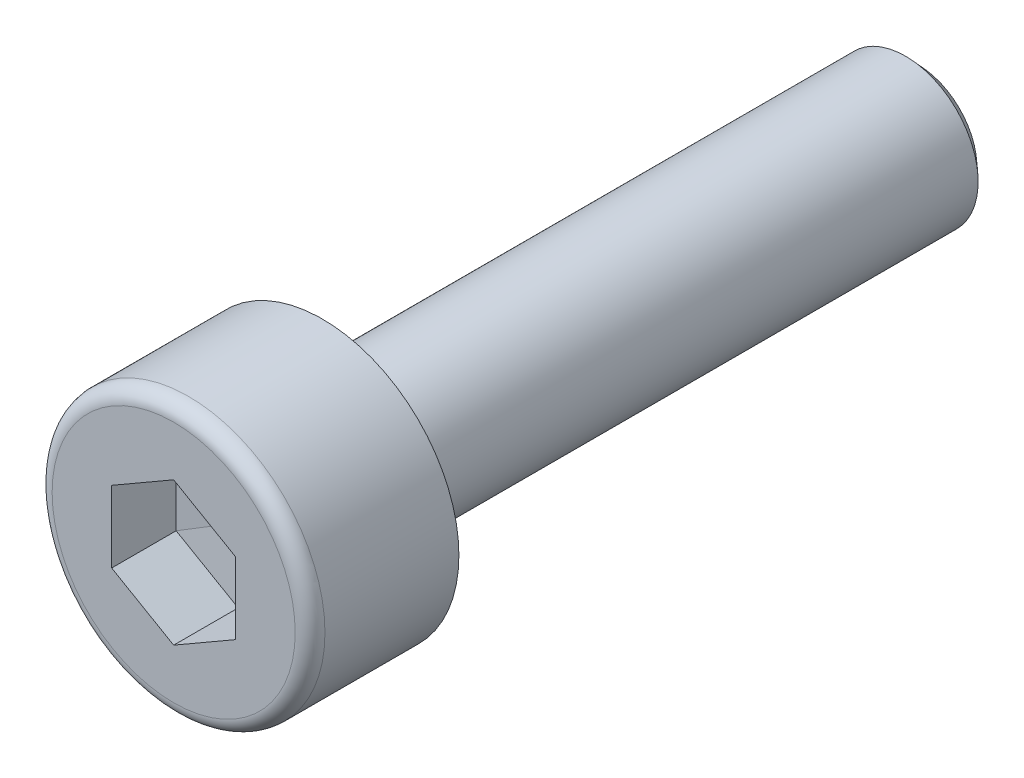
ISO-10303-21;
HEADER;
FILE_DESCRIPTION(('STEP AP214'),'2;1');
FILE_NAME('part.step','',(''),(''),'','','');
FILE_SCHEMA(('AUTOMOTIVE_DESIGN { 1 0 10303 214 1 1 1 1 }'));
ENDSEC;
DATA;
#1=APPLICATION_CONTEXT('core data for automotive mechanical design processes');
#2=APPLICATION_PROTOCOL_DEFINITION('international standard','automotive_design',2000,#1);
#3=PRODUCT_CONTEXT('',#1,'mechanical');
#4=PRODUCT('Part','Part','',(#3));
#5=PRODUCT_RELATED_PRODUCT_CATEGORY('part','',(#4));
#6=PRODUCT_DEFINITION_FORMATION('','',#4);
#7=PRODUCT_DEFINITION_CONTEXT('part definition',#1,'design');
#8=PRODUCT_DEFINITION('design','',#6,#7);
#9=PRODUCT_DEFINITION_SHAPE('','',#8);
#10=(LENGTH_UNIT() NAMED_UNIT(*) SI_UNIT(.MILLI.,.METRE.));
#11=(NAMED_UNIT(*) PLANE_ANGLE_UNIT() SI_UNIT($,.RADIAN.));
#12=(NAMED_UNIT(*) SI_UNIT($,.STERADIAN.) SOLID_ANGLE_UNIT());
#13=UNCERTAINTY_MEASURE_WITH_UNIT(LENGTH_MEASURE(1.E-05),#10,'distance_accuracy_value','');
#14=(GEOMETRIC_REPRESENTATION_CONTEXT(3) GLOBAL_UNCERTAINTY_ASSIGNED_CONTEXT((#13)) GLOBAL_UNIT_ASSIGNED_CONTEXT((#10,
#11,#12)) REPRESENTATION_CONTEXT('',''));
#15=CARTESIAN_POINT('',(0.,0.,0.));
#16=DIRECTION('',(0.,0.,1.));
#17=DIRECTION('',(1.,0.,0.));
#18=AXIS2_PLACEMENT_3D('',#15,#16,#17);
#19=CARTESIAN_POINT('',(-1.50000000000011,0.,-1.93470335983093E-13));
#20=DIRECTION('',(0.,0.,-1.));
#21=DIRECTION('',(0.,-1.,0.));
#22=AXIS2_PLACEMENT_3D('',#19,#20,#21);
#23=PLANE('',#22);
#24=CARTESIAN_POINT('',(-1.10557921610427E-13,0.,-1.77635683940025E-13));
#25=DIRECTION('',(0.,0.,-1.));
#26=DIRECTION('',(-1.,0.,0.));
#27=AXIS2_PLACEMENT_3D('',#24,#25,#26);
#28=CIRCLE('',#27,1.4635);
#29=CARTESIAN_POINT('',(-1.46350000000011,0.,-1.92747036469691E-13));
#30=VERTEX_POINT('',#29);
#31=EDGE_CURVE('E11',#30,#30,#28,.T.);
#32=ORIENTED_EDGE('',*,*,#31,.F.);
#33=EDGE_LOOP('',(#32));
#34=FACE_BOUND('',#33,.T.);
#35=CARTESIAN_POINT('',(-1.10557921610426E-13,0.,-3.3104020176651E-13));
#36=DIRECTION('',(0.,0.,-1.));
#37=DIRECTION('',(1.,0.,0.));
#38=AXIS2_PLACEMENT_3D('',#35,#36,#37);
#39=CIRCLE('',#38,2.75);
#40=CARTESIAN_POINT('',(2.74999999999989,0.,-3.0277835099299E-13));
#41=VERTEX_POINT('',#40);
#42=EDGE_CURVE('E115',#41,#41,#39,.T.);
#43=ORIENTED_EDGE('',*,*,#42,.T.);
#44=EDGE_LOOP('',(#43));
#45=FACE_BOUND('',#44,.T.);
#46=ADVANCED_FACE('F17',(#34,#45),#23,.T.);
#47=CARTESIAN_POINT('',(0.,0.,-12.));
#48=DIRECTION('',(0.,0.,-1.));
#49=DIRECTION('',(0.,-1.,0.));
#50=AXIS2_PLACEMENT_3D('',#47,#48,#49);
#51=PLANE('',#50);
#52=CARTESIAN_POINT('',(0.,0.,-12.));
#53=DIRECTION('',(0.,0.,-1.));
#54=DIRECTION('',(-1.,0.,0.));
#55=AXIS2_PLACEMENT_3D('',#52,#53,#54);
#56=CIRCLE('',#55,1.193275);
#57=CARTESIAN_POINT('',(-1.193275,0.,-12.));
#58=VERTEX_POINT('',#57);
#59=EDGE_CURVE('E252',#58,#58,#56,.T.);
#60=ORIENTED_EDGE('',*,*,#59,.T.);
#61=EDGE_LOOP('',(#60));
#62=FACE_BOUND('',#61,.T.);
#63=ADVANCED_FACE('F313',(#62),#51,.T.);
#64=CARTESIAN_POINT('',(0.,0.,-6.00000000000008));
#65=DIRECTION('',(0.,0.,-1.));
#66=DIRECTION('',(-1.,0.,0.));
#67=AXIS2_PLACEMENT_3D('',#64,#65,#66);
#68=CYLINDRICAL_SURFACE('',#67,1.4635);
#69=ORIENTED_EDGE('',*,*,#31,.T.);
#70=EDGE_LOOP('',(#69));
#71=FACE_BOUND('',#70,.T.);
#72=CARTESIAN_POINT('',(0.,0.,-11.7538502839854));
#73=DIRECTION('',(0.,0.,1.));
#74=DIRECTION('',(-1.,0.,0.));
#75=AXIS2_PLACEMENT_3D('',#72,#73,#74);
#76=CIRCLE('',#75,1.4635);
#77=CARTESIAN_POINT('',(-1.46349999999999,0.,-11.7538502839854));
#78=VERTEX_POINT('',#77);
#79=EDGE_CURVE('E291',#78,#78,#76,.T.);
#80=ORIENTED_EDGE('',*,*,#79,.T.);
#81=EDGE_LOOP('',(#80));
#82=FACE_BOUND('',#81,.T.);
#83=ADVANCED_FACE('F297',(#71,#82),#68,.T.);
#84=CARTESIAN_POINT('',(0.,-1.44337567297406,3.));
#85=DIRECTION('',(-0.5,-0.866025403784439,0.));
#86=DIRECTION('',(-0.866025403784439,0.5,0.));
#87=AXIS2_PLACEMENT_3D('',#84,#85,#86);
#88=PLANE('',#87);
#89=DIRECTION('',(-0.866025403784439,0.5,0.));
#90=VECTOR('',#89,1.);
#91=CARTESIAN_POINT('',(-1.34375000000004,-0.667561248750479,2.99999999999966));
#92=LINE('',#91,#90);
#93=CARTESIAN_POINT('',(0.,-1.44337567297406,3.));
#94=VERTEX_POINT('',#93);
#95=CARTESIAN_POINT('',(-1.25,-0.721687836487032,3.));
#96=VERTEX_POINT('',#95);
#97=EDGE_CURVE('E274',#94,#96,#92,.T.);
#98=ORIENTED_EDGE('',*,*,#97,.F.);
#99=DIRECTION('',(0.,0.,-1.));
#100=VECTOR('',#99,1.);
#101=CARTESIAN_POINT('',(0.,-1.44337567297406,3.));
#102=LINE('',#101,#100);
#103=CARTESIAN_POINT('',(0.,-1.44337567297406,1.7));
#104=VERTEX_POINT('',#103);
#105=EDGE_CURVE('E105',#94,#104,#102,.T.);
#106=ORIENTED_EDGE('',*,*,#105,.T.);
#107=DIRECTION('',(-0.866025403784439,0.5,0.));
#108=VECTOR('',#107,1.);
#109=CARTESIAN_POINT('',(-1.25,-0.721687836487032,1.7));
#110=LINE('',#109,#108);
#111=CARTESIAN_POINT('',(-1.25,-0.721687836487032,1.7));
#112=VERTEX_POINT('',#111);
#113=EDGE_CURVE('E170',#104,#112,#110,.T.);
#114=ORIENTED_EDGE('',*,*,#113,.T.);
#115=DIRECTION('',(0.,0.,-1.));
#116=VECTOR('',#115,1.);
#117=CARTESIAN_POINT('',(-1.25,-0.721687836487032,3.));
#118=LINE('',#117,#116);
#119=EDGE_CURVE('E25',#96,#112,#118,.T.);
#120=ORIENTED_EDGE('',*,*,#119,.F.);
#121=EDGE_LOOP('',(#98,#106,#114,#120));
#122=FACE_BOUND('',#121,.T.);
#123=ADVANCED_FACE('F360',(#122),#88,.F.);
#124=CARTESIAN_POINT('',(-1.25,-0.721687836487032,3.));
#125=DIRECTION('',(-1.,0.,0.));
#126=DIRECTION('',(0.,0.,1.));
#127=AXIS2_PLACEMENT_3D('',#124,#125,#126);
#128=PLANE('',#127);
#129=DIRECTION('',(0.,1.,0.));
#130=VECTOR('',#129,1.);
#131=CARTESIAN_POINT('',(-1.25,-0.360843918243516,2.99999999999966));
#132=LINE('',#131,#130);
#133=CARTESIAN_POINT('',(-1.25,0.721687836487033,3.));
#134=VERTEX_POINT('',#133);
#135=EDGE_CURVE('E127',#96,#134,#132,.T.);
#136=ORIENTED_EDGE('',*,*,#135,.F.);
#137=ORIENTED_EDGE('',*,*,#119,.T.);
#138=DIRECTION('',(0.,1.,0.));
#139=VECTOR('',#138,1.);
#140=CARTESIAN_POINT('',(-1.25,0.721687836487033,1.7));
#141=LINE('',#140,#139);
#142=CARTESIAN_POINT('',(-1.25,0.721687836487033,1.7));
#143=VERTEX_POINT('',#142);
#144=EDGE_CURVE('E164',#112,#143,#141,.T.);
#145=ORIENTED_EDGE('',*,*,#144,.T.);
#146=DIRECTION('',(0.,0.,-1.));
#147=VECTOR('',#146,1.);
#148=CARTESIAN_POINT('',(-1.25,0.721687836487033,3.));
#149=LINE('',#148,#147);
#150=EDGE_CURVE('E46',#134,#143,#149,.T.);
#151=ORIENTED_EDGE('',*,*,#150,.F.);
#152=EDGE_LOOP('',(#136,#137,#145,#151));
#153=FACE_BOUND('',#152,.T.);
#154=ADVANCED_FACE('F357',(#153),#128,.F.);
#155=CARTESIAN_POINT('',(-1.25,0.721687836487033,3.));
#156=DIRECTION('',(-0.5,0.866025403784439,0.));
#157=DIRECTION('',(0.,0.,1.));
#158=AXIS2_PLACEMENT_3D('',#155,#156,#157);
#159=PLANE('',#158);
#160=DIRECTION('',(0.866025403784439,0.5,0.));
#161=VECTOR('',#160,1.);
#162=CARTESIAN_POINT('',(-1.96875000000004,0.306717330506964,2.99999999999965));
#163=LINE('',#162,#161);
#164=CARTESIAN_POINT('',(0.,1.44337567297406,3.));
#165=VERTEX_POINT('',#164);
#166=EDGE_CURVE('E120',#134,#165,#163,.T.);
#167=ORIENTED_EDGE('',*,*,#166,.F.);
#168=ORIENTED_EDGE('',*,*,#150,.T.);
#169=DIRECTION('',(0.866025403784439,0.5,0.));
#170=VECTOR('',#169,1.);
#171=CARTESIAN_POINT('',(0.,1.44337567297406,1.7));
#172=LINE('',#171,#170);
#173=CARTESIAN_POINT('',(0.,1.44337567297406,1.7));
#174=VERTEX_POINT('',#173);
#175=EDGE_CURVE('E157',#143,#174,#172,.T.);
#176=ORIENTED_EDGE('',*,*,#175,.T.);
#177=DIRECTION('',(0.,0.,-1.));
#178=VECTOR('',#177,1.);
#179=CARTESIAN_POINT('',(0.,1.44337567297406,3.));
#180=LINE('',#179,#178);
#181=EDGE_CURVE('E104',#165,#174,#180,.T.);
#182=ORIENTED_EDGE('',*,*,#181,.F.);
#183=EDGE_LOOP('',(#167,#168,#176,#182));
#184=FACE_BOUND('',#183,.T.);
#185=ADVANCED_FACE('F356',(#184),#159,.F.);
#186=CARTESIAN_POINT('',(0.,1.44337567297406,3.));
#187=DIRECTION('',(0.5,0.866025403784439,0.));
#188=DIRECTION('',(0.,0.,-1.));
#189=AXIS2_PLACEMENT_3D('',#186,#187,#188);
#190=PLANE('',#189);
#191=DIRECTION('',(0.866025403784439,-0.5,0.));
#192=VECTOR('',#191,1.);
#193=CARTESIAN_POINT('',(-0.718750000000044,1.85834617895413,2.99999999999966));
#194=LINE('',#193,#192);
#195=CARTESIAN_POINT('',(1.25,0.721687836487032,3.));
#196=VERTEX_POINT('',#195);
#197=EDGE_CURVE('E96',#165,#196,#194,.T.);
#198=ORIENTED_EDGE('',*,*,#197,.F.);
#199=ORIENTED_EDGE('',*,*,#181,.T.);
#200=DIRECTION('',(0.866025403784439,-0.5,0.));
#201=VECTOR('',#200,1.);
#202=CARTESIAN_POINT('',(1.25,0.721687836487032,1.7));
#203=LINE('',#202,#201);
#204=CARTESIAN_POINT('',(1.25,0.721687836487032,1.7));
#205=VERTEX_POINT('',#204);
#206=EDGE_CURVE('E99',#174,#205,#203,.T.);
#207=ORIENTED_EDGE('',*,*,#206,.T.);
#208=DIRECTION('',(0.,0.,-1.));
#209=VECTOR('',#208,1.);
#210=CARTESIAN_POINT('',(1.25,0.721687836487032,3.));
#211=LINE('',#210,#209);
#212=EDGE_CURVE('E92',#196,#205,#211,.T.);
#213=ORIENTED_EDGE('',*,*,#212,.F.);
#214=EDGE_LOOP('',(#198,#199,#207,#213));
#215=FACE_BOUND('',#214,.T.);
#216=ADVANCED_FACE('F94',(#215),#190,.F.);
#217=CARTESIAN_POINT('',(1.25,0.721687836487032,3.));
#218=DIRECTION('',(1.,0.,0.));
#219=DIRECTION('',(0.,1.,0.));
#220=AXIS2_PLACEMENT_3D('',#217,#218,#219);
#221=PLANE('',#220);
#222=DIRECTION('',(0.,-1.,0.));
#223=VECTOR('',#222,1.);
#224=CARTESIAN_POINT('',(1.25,0.360843918243516,2.99999999999968));
#225=LINE('',#224,#223);
#226=CARTESIAN_POINT('',(1.25,-0.721687836487032,3.));
#227=VERTEX_POINT('',#226);
#228=EDGE_CURVE('E108',#196,#227,#225,.T.);
#229=ORIENTED_EDGE('',*,*,#228,.F.);
#230=ORIENTED_EDGE('',*,*,#212,.T.);
#231=DIRECTION('',(0.,-1.,0.));
#232=VECTOR('',#231,1.);
#233=CARTESIAN_POINT('',(1.25,-0.721687836487032,1.7));
#234=LINE('',#233,#232);
#235=CARTESIAN_POINT('',(1.25,-0.721687836487032,1.7));
#236=VERTEX_POINT('',#235);
#237=EDGE_CURVE('E144',#205,#236,#234,.T.);
#238=ORIENTED_EDGE('',*,*,#237,.T.);
#239=DIRECTION('',(0.,0.,-1.));
#240=VECTOR('',#239,1.);
#241=CARTESIAN_POINT('',(1.25,-0.721687836487032,3.));
#242=LINE('',#241,#240);
#243=EDGE_CURVE('E110',#227,#236,#242,.T.);
#244=ORIENTED_EDGE('',*,*,#243,.F.);
#245=EDGE_LOOP('',(#229,#230,#238,#244));
#246=FACE_BOUND('',#245,.T.);
#247=ADVANCED_FACE('F109',(#246),#221,.F.);
#248=CARTESIAN_POINT('',(1.25,-0.721687836487032,3.));
#249=DIRECTION('',(0.5,-0.866025403784439,0.));
#250=DIRECTION('',(0.,0.,-1.));
#251=AXIS2_PLACEMENT_3D('',#248,#249,#250);
#252=PLANE('',#251);
#253=DIRECTION('',(-0.866025403784439,-0.5,0.));
#254=VECTOR('',#253,1.);
#255=CARTESIAN_POINT('',(-0.0937500000000439,-1.49750226071062,2.99999999999967));
#256=LINE('',#255,#254);
#257=EDGE_CURVE('E268',#227,#94,#256,.T.);
#258=ORIENTED_EDGE('',*,*,#257,.F.);
#259=ORIENTED_EDGE('',*,*,#243,.T.);
#260=DIRECTION('',(-0.866025403784439,-0.5,0.));
#261=VECTOR('',#260,1.);
#262=CARTESIAN_POINT('',(0.,-1.44337567297406,1.7));
#263=LINE('',#262,#261);
#264=EDGE_CURVE('E136',#236,#104,#263,.T.);
#265=ORIENTED_EDGE('',*,*,#264,.T.);
#266=ORIENTED_EDGE('',*,*,#105,.F.);
#267=EDGE_LOOP('',(#258,#259,#265,#266));
#268=FACE_BOUND('',#267,.T.);
#269=ADVANCED_FACE('F337',(#268),#252,.F.);
#270=CARTESIAN_POINT('',(-1.25,-0.721687836487032,1.7));
#271=DIRECTION('',(-0.043577871373829,-0.0754790873051733,-0.996194698091746));
#272=DIRECTION('',(0.,-0.997141949694317,0.0755508581011305));
#273=AXIS2_PLACEMENT_3D('',#270,#271,#272);
#274=PLANE('',#273);
#275=DIRECTION('',(0.863550259614423,0.498570974847158,-0.0755508581011305));
#276=VECTOR('',#275,1.);
#277=CARTESIAN_POINT('',(-0.939283728799944,-0.542295713668081,1.67281584869695));
#278=LINE('',#277,#276);
#279=CARTESIAN_POINT('',(0.,0.,1.5906391705926));
#280=VERTEX_POINT('',#279);
#281=EDGE_CURVE('E167',#112,#280,#278,.T.);
#282=ORIENTED_EDGE('',*,*,#281,.F.);
#283=ORIENTED_EDGE('',*,*,#113,.F.);
#284=DIRECTION('',(0.,0.997141949694317,-0.0755508581011306));
#285=VECTOR('',#284,1.);
#286=CARTESIAN_POINT('',(0.,-1.08459142733616,1.67281584869695));
#287=LINE('',#286,#285);
#288=EDGE_CURVE('E132',#104,#280,#287,.T.);
#289=ORIENTED_EDGE('',*,*,#288,.T.);
#290=EDGE_LOOP('',(#282,#283,#289));
#291=FACE_BOUND('',#290,.T.);
#292=ADVANCED_FACE('F339',(#291),#274,.F.);
#293=CARTESIAN_POINT('',(-1.25,0.721687836487033,1.7));
#294=DIRECTION('',(-0.0871557427476581,0.,-0.996194698091746));
#295=DIRECTION('',(-0.996194698091746,0.,0.0871557427476581));
#296=AXIS2_PLACEMENT_3D('',#293,#294,#295);
#297=PLANE('',#296);
#298=DIRECTION('',(0.863550259614423,-0.498570974847159,-0.0755508581011305));
#299=VECTOR('',#298,1.);
#300=CARTESIAN_POINT('',(-0.939283728799943,0.542295713668083,1.67281584869695));
#301=LINE('',#300,#299);
#302=EDGE_CURVE('E160',#143,#280,#301,.T.);
#303=ORIENTED_EDGE('',*,*,#302,.F.);
#304=ORIENTED_EDGE('',*,*,#144,.F.);
#305=ORIENTED_EDGE('',*,*,#281,.T.);
#306=EDGE_LOOP('',(#303,#304,#305));
#307=FACE_BOUND('',#306,.T.);
#308=ADVANCED_FACE('F352',(#307),#297,.F.);
#309=CARTESIAN_POINT('',(0.,1.44337567297406,1.7));
#310=DIRECTION('',(-0.043577871373829,0.0754790873051733,-0.996194698091746));
#311=DIRECTION('',(-0.999044587684655,0.,0.043702537889669));
#312=AXIS2_PLACEMENT_3D('',#309,#310,#311);
#313=PLANE('',#312);
#314=DIRECTION('',(0.,-0.997141949694317,-0.0755508581011306));
#315=VECTOR('',#314,1.);
#316=CARTESIAN_POINT('',(0.,1.08459142733616,1.67281584869695));
#317=LINE('',#316,#315);
#318=EDGE_CURVE('E153',#174,#280,#317,.T.);
#319=ORIENTED_EDGE('',*,*,#318,.F.);
#320=ORIENTED_EDGE('',*,*,#175,.F.);
#321=ORIENTED_EDGE('',*,*,#302,.T.);
#322=EDGE_LOOP('',(#319,#320,#321));
#323=FACE_BOUND('',#322,.T.);
#324=ADVANCED_FACE('F348',(#323),#313,.F.);
#325=CARTESIAN_POINT('',(1.25,0.721687836487032,1.7));
#326=DIRECTION('',(0.0435778713738291,0.0754790873051733,-0.996194698091746));
#327=DIRECTION('',(-0.999044587684655,0.,-0.0437025378896691));
#328=AXIS2_PLACEMENT_3D('',#325,#326,#327);
#329=PLANE('',#328);
#330=DIRECTION('',(-0.863550259614423,-0.498570974847158,-0.0755508581011305));
#331=VECTOR('',#330,1.);
#332=CARTESIAN_POINT('',(0.939283728799944,0.542295713668082,1.67281584869695));
#333=LINE('',#332,#331);
#334=EDGE_CURVE('E147',#205,#280,#333,.T.);
#335=ORIENTED_EDGE('',*,*,#334,.F.);
#336=ORIENTED_EDGE('',*,*,#206,.F.);
#337=ORIENTED_EDGE('',*,*,#318,.T.);
#338=EDGE_LOOP('',(#335,#336,#337));
#339=FACE_BOUND('',#338,.T.);
#340=ADVANCED_FACE('F344',(#339),#329,.F.);
#341=CARTESIAN_POINT('',(1.25,-0.721687836487032,1.7));
#342=DIRECTION('',(0.0871557427476581,0.,-0.996194698091746));
#343=DIRECTION('',(0.,-1.,0.));
#344=AXIS2_PLACEMENT_3D('',#341,#342,#343);
#345=PLANE('',#344);
#346=DIRECTION('',(-0.863550259614423,0.498570974847158,-0.0755508581011305));
#347=VECTOR('',#346,1.);
#348=CARTESIAN_POINT('',(0.939283728799943,-0.542295713668083,1.67281584869695));
#349=LINE('',#348,#347);
#350=EDGE_CURVE('E140',#236,#280,#349,.T.);
#351=ORIENTED_EDGE('',*,*,#350,.F.);
#352=ORIENTED_EDGE('',*,*,#237,.F.);
#353=ORIENTED_EDGE('',*,*,#334,.T.);
#354=EDGE_LOOP('',(#351,#352,#353));
#355=FACE_BOUND('',#354,.T.);
#356=ADVANCED_FACE('F332',(#355),#345,.F.);
#357=CARTESIAN_POINT('',(0.,-1.44337567297406,1.7));
#358=DIRECTION('',(0.0435778713738291,-0.0754790873051733,-0.996194698091746));
#359=DIRECTION('',(0.,-0.997141949694317,0.0755508581011305));
#360=AXIS2_PLACEMENT_3D('',#357,#358,#359);
#361=PLANE('',#360);
#362=ORIENTED_EDGE('',*,*,#288,.F.);
#363=ORIENTED_EDGE('',*,*,#264,.F.);
#364=ORIENTED_EDGE('',*,*,#350,.T.);
#365=EDGE_LOOP('',(#362,#363,#364));
#366=FACE_BOUND('',#365,.T.);
#367=ADVANCED_FACE('F325',(#366),#361,.F.);
#368=CARTESIAN_POINT('',(-1.259734765778E-13,0.,1.49999999999967));
#369=DIRECTION('',(0.,0.,-1.));
#370=DIRECTION('',(-1.,0.,0.));
#371=AXIS2_PLACEMENT_3D('',#368,#369,#370);
#372=CYLINDRICAL_SURFACE('',#371,2.75);
#373=CARTESIAN_POINT('',(-1.383059205517E-13,0.,2.69999999999967));
#374=DIRECTION('',(0.,0.,1.));
#375=DIRECTION('',(1.,0.,0.));
#376=AXIS2_PLACEMENT_3D('',#373,#374,#375);
#377=CIRCLE('',#376,2.75);
#378=CARTESIAN_POINT('',(2.74999999999986,0.,2.6999999999997));
#379=VERTEX_POINT('',#378);
#380=EDGE_CURVE('E256',#379,#379,#377,.T.);
#381=ORIENTED_EDGE('',*,*,#380,.F.);
#382=EDGE_LOOP('',(#381));
#383=FACE_BOUND('',#382,.T.);
#384=ORIENTED_EDGE('',*,*,#42,.F.);
#385=EDGE_LOOP('',(#384));
#386=FACE_BOUND('',#385,.T.);
#387=ADVANCED_FACE('F323',(#383,#386),#372,.T.);
#388=CARTESIAN_POINT('',(-2.75000000000012,0.,2.99999999999964));
#389=DIRECTION('',(0.,0.,1.));
#390=DIRECTION('',(1.,0.,0.));
#391=AXIS2_PLACEMENT_3D('',#388,#389,#390);
#392=PLANE('',#391);
#393=ORIENTED_EDGE('',*,*,#257,.T.);
#394=ORIENTED_EDGE('',*,*,#97,.T.);
#395=ORIENTED_EDGE('',*,*,#135,.T.);
#396=ORIENTED_EDGE('',*,*,#166,.T.);
#397=ORIENTED_EDGE('',*,*,#197,.T.);
#398=ORIENTED_EDGE('',*,*,#228,.T.);
#399=EDGE_LOOP('',(#393,#394,#395,#396,#397,#398));
#400=FACE_BOUND('',#399,.T.);
#401=CARTESIAN_POINT('',(-1.41389031545174E-13,0.,2.99999999999967));
#402=DIRECTION('',(0.,0.,-1.));
#403=DIRECTION('',(1.,0.,0.));
#404=AXIS2_PLACEMENT_3D('',#401,#402,#403);
#405=CIRCLE('',#404,2.45);
#406=CARTESIAN_POINT('',(2.44999999999986,0.,2.9999999999997));
#407=VERTEX_POINT('',#406);
#408=EDGE_CURVE('E261',#407,#407,#405,.T.);
#409=ORIENTED_EDGE('',*,*,#408,.F.);
#410=EDGE_LOOP('',(#409));
#411=FACE_BOUND('',#410,.T.);
#412=ADVANCED_FACE('F117',(#400,#411),#392,.T.);
#413=CARTESIAN_POINT('',(-1.383059205517E-13,0.,2.69999999999967));
#414=DIRECTION('',(0.,0.,-1.));
#415=DIRECTION('',(-1.,0.,0.));
#416=AXIS2_PLACEMENT_3D('',#413,#414,#415);
#417=TOROIDAL_SURFACE('',#416,2.45,0.3);
#418=ORIENTED_EDGE('',*,*,#408,.T.);
#419=EDGE_LOOP('',(#418));
#420=FACE_BOUND('',#419,.T.);
#421=ORIENTED_EDGE('',*,*,#380,.T.);
#422=EDGE_LOOP('',(#421));
#423=FACE_BOUND('',#422,.T.);
#424=ADVANCED_FACE('F301',(#420,#423),#417,.T.);
#425=CARTESIAN_POINT('',(0.,0.,-11.8466375));
#426=DIRECTION('',(0.,0.,1.));
#427=DIRECTION('',(-1.,0.,0.));
#428=AXIS2_PLACEMENT_3D('',#425,#426,#427);
#429=CONICAL_SURFACE('',#428,1.36163749999998,0.831988093682976);
#430=ORIENTED_EDGE('',*,*,#59,.F.);
#431=EDGE_LOOP('',(#430));
#432=FACE_BOUND('',#431,.T.);
#433=ORIENTED_EDGE('',*,*,#79,.F.);
#434=EDGE_LOOP('',(#433));
#435=FACE_BOUND('',#434,.T.);
#436=ADVANCED_FACE('F299',(#432,#435),#429,.T.);
#437=CLOSED_SHELL('',(#46,#63,#83,#123,#154,#185,#216,#247,#269,#292,#308,#324,#340,#356,#367,
#387,#412,#424,#436));
#438=MANIFOLD_SOLID_BREP('B1',#437);
#439=ADVANCED_BREP_SHAPE_REPRESENTATION('',(#18,#438),#14);
#440=SHAPE_DEFINITION_REPRESENTATION(#9,#439);
ENDSEC;
END-ISO-10303-21;
